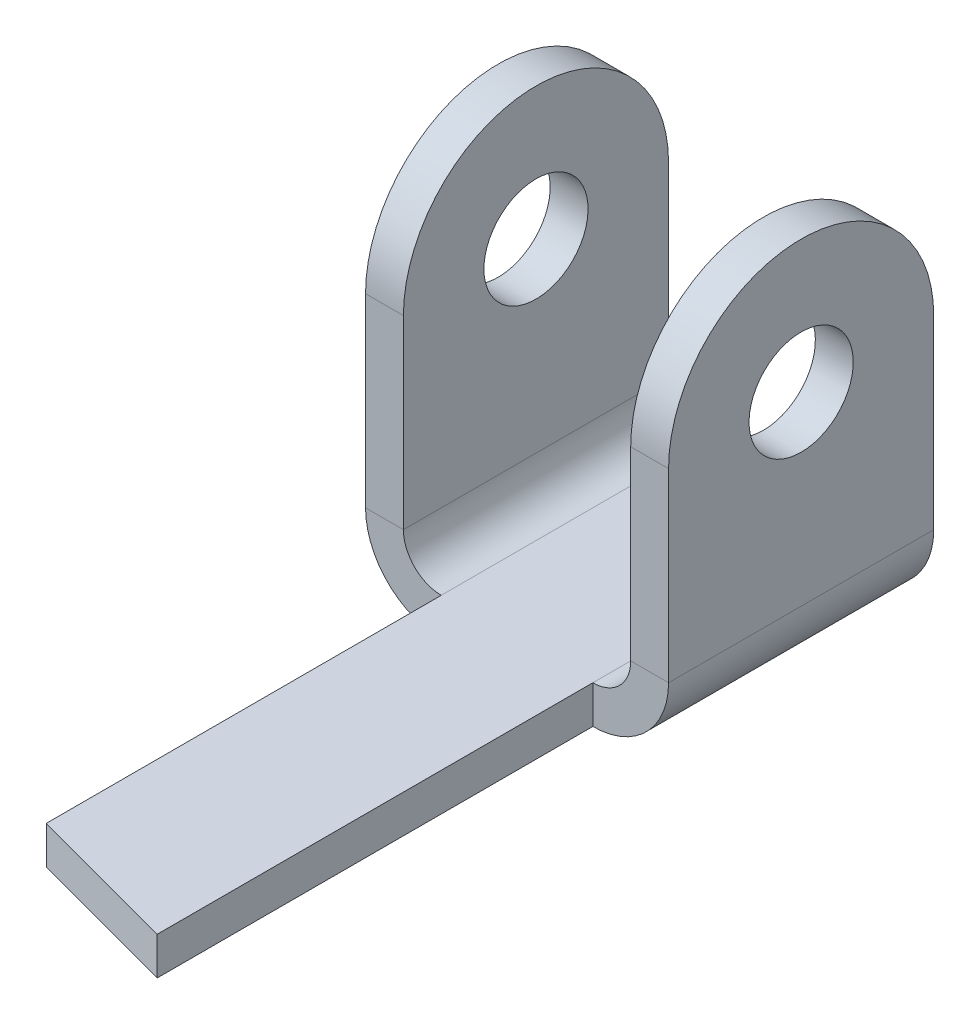
ISO-10303-21;
HEADER;
FILE_DESCRIPTION(('STEP AP214'),'2;1');
FILE_NAME('part.step','',(''),(''),'','','');
FILE_SCHEMA(('AUTOMOTIVE_DESIGN { 1 0 10303 214 1 1 1 1 }'));
ENDSEC;
DATA;
#1=APPLICATION_CONTEXT('core data for automotive mechanical design processes');
#2=APPLICATION_PROTOCOL_DEFINITION('international standard','automotive_design',2000,#1);
#3=PRODUCT_CONTEXT('',#1,'mechanical');
#4=PRODUCT('Part','Part','',(#3));
#5=PRODUCT_RELATED_PRODUCT_CATEGORY('part','',(#4));
#6=PRODUCT_DEFINITION_FORMATION('','',#4);
#7=PRODUCT_DEFINITION_CONTEXT('part definition',#1,'design');
#8=PRODUCT_DEFINITION('design','',#6,#7);
#9=PRODUCT_DEFINITION_SHAPE('','',#8);
#10=(LENGTH_UNIT() NAMED_UNIT(*) SI_UNIT(.MILLI.,.METRE.));
#11=(NAMED_UNIT(*) PLANE_ANGLE_UNIT() SI_UNIT($,.RADIAN.));
#12=(NAMED_UNIT(*) SI_UNIT($,.STERADIAN.) SOLID_ANGLE_UNIT());
#13=UNCERTAINTY_MEASURE_WITH_UNIT(LENGTH_MEASURE(1.E-05),#10,'distance_accuracy_value','');
#14=(GEOMETRIC_REPRESENTATION_CONTEXT(3) GLOBAL_UNCERTAINTY_ASSIGNED_CONTEXT((#13)) GLOBAL_UNIT_ASSIGNED_CONTEXT((#10,
#11,#12)) REPRESENTATION_CONTEXT('',''));
#15=CARTESIAN_POINT('',(0.,0.,0.));
#16=DIRECTION('',(0.,0.,1.));
#17=DIRECTION('',(1.,0.,0.));
#18=AXIS2_PLACEMENT_3D('',#15,#16,#17);
#19=CARTESIAN_POINT('',(-4.,-2.,18.5));
#20=DIRECTION('',(-1.,0.,0.));
#21=DIRECTION('',(0.,0.,1.));
#22=AXIS2_PLACEMENT_3D('',#19,#20,#21);
#23=PLANE('',#22);
#24=DIRECTION('',(0.,0.,1.));
#25=VECTOR('',#24,1.);
#26=CARTESIAN_POINT('',(-4.,-2.,18.5));
#27=LINE('',#26,#25);
#28=CARTESIAN_POINT('',(-4.,-2.,-4.5));
#29=VERTEX_POINT('',#28);
#30=CARTESIAN_POINT('',(-4.,-2.,16.3564064605511));
#31=VERTEX_POINT('',#30);
#32=EDGE_CURVE('E194',#29,#31,#27,.T.);
#33=ORIENTED_EDGE('',*,*,#32,.T.);
#34=DIRECTION('',(0.,-1.,0.));
#35=VECTOR('',#34,1.);
#36=CARTESIAN_POINT('',(-4.,-2.,16.3564064605511));
#37=LINE('',#36,#35);
#38=CARTESIAN_POINT('',(-4.,0.,16.3564064605511));
#39=VERTEX_POINT('',#38);
#40=EDGE_CURVE('E180',#31,#39,#37,.F.);
#41=ORIENTED_EDGE('',*,*,#40,.T.);
#42=DIRECTION('',(0.,0.,1.));
#43=VECTOR('',#42,1.);
#44=CARTESIAN_POINT('',(-4.,0.,18.5));
#45=LINE('',#44,#43);
#46=CARTESIAN_POINT('',(-4.,0.,-4.5));
#47=VERTEX_POINT('',#46);
#48=EDGE_CURVE('E191',#47,#39,#45,.T.);
#49=ORIENTED_EDGE('',*,*,#48,.F.);
#50=DIRECTION('',(0.,-1.,0.));
#51=VECTOR('',#50,1.);
#52=CARTESIAN_POINT('',(-4.,0.,-4.5));
#53=LINE('',#52,#51);
#54=EDGE_CURVE('E240',#47,#29,#53,.T.);
#55=ORIENTED_EDGE('',*,*,#54,.T.);
#56=EDGE_LOOP('',(#33,#41,#49,#55));
#57=FACE_BOUND('',#56,.T.);
#58=ADVANCED_FACE('F75',(#57),#23,.T.);
#59=CARTESIAN_POINT('',(0.,-2.,0.));
#60=DIRECTION('',(0.,-1.,0.));
#61=DIRECTION('',(0.,0.,-1.));
#62=AXIS2_PLACEMENT_3D('',#59,#60,#61);
#63=PLANE('',#62);
#64=DIRECTION('',(0.,0.,-1.));
#65=VECTOR('',#64,1.);
#66=CARTESIAN_POINT('',(4.,-2.,18.5));
#67=LINE('',#66,#65);
#68=CARTESIAN_POINT('',(4.,-2.,18.5));
#69=VERTEX_POINT('',#68);
#70=CARTESIAN_POINT('',(4.,-2.,-4.5));
#71=VERTEX_POINT('',#70);
#72=EDGE_CURVE('E202',#69,#71,#67,.T.);
#73=ORIENTED_EDGE('',*,*,#72,.F.);
#74=DIRECTION('',(-0.96592582628907,0.,-0.258819045102514));
#75=VECTOR('',#74,1.);
#76=CARTESIAN_POINT('',(-4.35705080756878,-2.,16.2607349850061));
#77=LINE('',#76,#75);
#78=EDGE_CURVE('E185',#69,#31,#77,.T.);
#79=ORIENTED_EDGE('',*,*,#78,.T.);
#80=ORIENTED_EDGE('',*,*,#32,.F.);
#81=CARTESIAN_POINT('',(-4.,-2.,-18.5));
#82=VERTEX_POINT('',#81);
#83=EDGE_CURVE('E219',#82,#29,#27,.T.);
#84=ORIENTED_EDGE('',*,*,#83,.F.);
#85=DIRECTION('',(-1.,0.,0.));
#86=VECTOR('',#85,1.);
#87=CARTESIAN_POINT('',(-4.,-2.,-18.5));
#88=LINE('',#87,#86);
#89=CARTESIAN_POINT('',(4.,-2.,-18.5));
#90=VERTEX_POINT('',#89);
#91=EDGE_CURVE('E228',#90,#82,#88,.T.);
#92=ORIENTED_EDGE('',*,*,#91,.F.);
#93=DIRECTION('',(0.,0.,-1.));
#94=VECTOR('',#93,1.);
#95=CARTESIAN_POINT('',(4.,-2.,-18.5));
#96=LINE('',#95,#94);
#97=EDGE_CURVE('E365',#90,#71,#96,.F.);
#98=ORIENTED_EDGE('',*,*,#97,.T.);
#99=EDGE_LOOP('',(#73,#79,#80,#84,#92,#98));
#100=FACE_BOUND('',#99,.T.);
#101=ADVANCED_FACE('F328',(#100),#63,.T.);
#102=CARTESIAN_POINT('',(0.,0.,0.));
#103=DIRECTION('',(0.,-1.,0.));
#104=DIRECTION('',(0.,0.,-1.));
#105=AXIS2_PLACEMENT_3D('',#102,#103,#104);
#106=PLANE('',#105);
#107=DIRECTION('',(-0.96592582628907,0.,-0.258819045102514));
#108=VECTOR('',#107,1.);
#109=CARTESIAN_POINT('',(-4.35705080756878,0.,16.2607349850061));
#110=LINE('',#109,#108);
#111=CARTESIAN_POINT('',(4.,0.,18.5));
#112=VERTEX_POINT('',#111);
#113=EDGE_CURVE('E177',#112,#39,#110,.T.);
#114=ORIENTED_EDGE('',*,*,#113,.F.);
#115=DIRECTION('',(0.,0.,-1.));
#116=VECTOR('',#115,1.);
#117=CARTESIAN_POINT('',(4.,0.,18.5));
#118=LINE('',#117,#116);
#119=CARTESIAN_POINT('',(4.,0.,-4.5));
#120=VERTEX_POINT('',#119);
#121=EDGE_CURVE('E204',#112,#120,#118,.T.);
#122=ORIENTED_EDGE('',*,*,#121,.T.);
#123=DIRECTION('',(0.,0.,-1.));
#124=VECTOR('',#123,1.);
#125=CARTESIAN_POINT('',(4.,0.,-18.5));
#126=LINE('',#125,#124);
#127=CARTESIAN_POINT('',(4.,0.,-18.5));
#128=VERTEX_POINT('',#127);
#129=EDGE_CURVE('E345',#128,#120,#126,.F.);
#130=ORIENTED_EDGE('',*,*,#129,.F.);
#131=DIRECTION('',(-1.,0.,0.));
#132=VECTOR('',#131,1.);
#133=CARTESIAN_POINT('',(-4.,0.,-18.5));
#134=LINE('',#133,#132);
#135=CARTESIAN_POINT('',(-4.,0.,-18.5));
#136=VERTEX_POINT('',#135);
#137=EDGE_CURVE('E200',#128,#136,#134,.T.);
#138=ORIENTED_EDGE('',*,*,#137,.T.);
#139=EDGE_CURVE('E199',#136,#47,#45,.T.);
#140=ORIENTED_EDGE('',*,*,#139,.T.);
#141=ORIENTED_EDGE('',*,*,#48,.T.);
#142=EDGE_LOOP('',(#114,#122,#130,#138,#140,#141));
#143=FACE_BOUND('',#142,.T.);
#144=ADVANCED_FACE('F197',(#143),#106,.F.);
#145=CARTESIAN_POINT('',(4.,-2.,18.5));
#146=DIRECTION('',(1.,0.,0.));
#147=DIRECTION('',(0.,0.,-1.));
#148=AXIS2_PLACEMENT_3D('',#145,#146,#147);
#149=PLANE('',#148);
#150=DIRECTION('',(0.,-1.,0.));
#151=VECTOR('',#150,1.);
#152=CARTESIAN_POINT('',(4.,0.,-4.5));
#153=LINE('',#152,#151);
#154=EDGE_CURVE('E92',#120,#71,#153,.T.);
#155=ORIENTED_EDGE('',*,*,#154,.F.);
#156=ORIENTED_EDGE('',*,*,#121,.F.);
#157=DIRECTION('',(0.,1.,0.));
#158=VECTOR('',#157,1.);
#159=CARTESIAN_POINT('',(4.,-2.,18.5));
#160=LINE('',#159,#158);
#161=EDGE_CURVE('E13',#69,#112,#160,.T.);
#162=ORIENTED_EDGE('',*,*,#161,.F.);
#163=ORIENTED_EDGE('',*,*,#72,.T.);
#164=EDGE_LOOP('',(#155,#156,#162,#163));
#165=FACE_BOUND('',#164,.T.);
#166=ADVANCED_FACE('F77',(#165),#149,.T.);
#167=CARTESIAN_POINT('',(-4.,-2.,-18.5));
#168=DIRECTION('',(0.,0.,-1.));
#169=DIRECTION('',(-1.,0.,0.));
#170=AXIS2_PLACEMENT_3D('',#167,#168,#169);
#171=PLANE('',#170);
#172=ORIENTED_EDGE('',*,*,#137,.F.);
#173=DIRECTION('',(0.,1.,0.));
#174=VECTOR('',#173,1.);
#175=CARTESIAN_POINT('',(4.,-2.,-18.5));
#176=LINE('',#175,#174);
#177=EDGE_CURVE('E208',#90,#128,#176,.T.);
#178=ORIENTED_EDGE('',*,*,#177,.F.);
#179=ORIENTED_EDGE('',*,*,#91,.T.);
#180=DIRECTION('',(0.,1.,0.));
#181=VECTOR('',#180,1.);
#182=CARTESIAN_POINT('',(-4.,-2.,-18.5));
#183=LINE('',#182,#181);
#184=EDGE_CURVE('E84',#82,#136,#183,.T.);
#185=ORIENTED_EDGE('',*,*,#184,.T.);
#186=EDGE_LOOP('',(#172,#178,#179,#185));
#187=FACE_BOUND('',#186,.T.);
#188=ADVANCED_FACE('F336',(#187),#171,.T.);
#189=CARTESIAN_POINT('',(-4.,2.,-18.5));
#190=DIRECTION('',(0.,0.,-1.));
#191=DIRECTION('',(-1.,0.,0.));
#192=AXIS2_PLACEMENT_3D('',#189,#190,#191);
#193=PLANE('',#192);
#194=DIRECTION('',(1.,0.,0.));
#195=VECTOR('',#194,1.);
#196=CARTESIAN_POINT('',(-8.,1.99999999999999,-18.5));
#197=LINE('',#196,#195);
#198=CARTESIAN_POINT('',(-6.,1.99999999999999,-18.5));
#199=VERTEX_POINT('',#198);
#200=CARTESIAN_POINT('',(-8.,1.99999999999999,-18.5));
#201=VERTEX_POINT('',#200);
#202=EDGE_CURVE('E291',#199,#201,#197,.F.);
#203=ORIENTED_EDGE('',*,*,#202,.F.);
#204=CARTESIAN_POINT('',(-4.,2.,-18.5));
#205=DIRECTION('',(0.,0.,1.));
#206=DIRECTION('',(1.,0.,0.));
#207=AXIS2_PLACEMENT_3D('',#204,#205,#206);
#208=CIRCLE('',#207,2.);
#209=EDGE_CURVE('E250',#136,#199,#208,.F.);
#210=ORIENTED_EDGE('',*,*,#209,.F.);
#211=ORIENTED_EDGE('',*,*,#184,.F.);
#212=CARTESIAN_POINT('',(-4.,2.,-18.5));
#213=DIRECTION('',(0.,0.,1.));
#214=DIRECTION('',(1.,0.,0.));
#215=AXIS2_PLACEMENT_3D('',#212,#213,#214);
#216=CIRCLE('',#215,4.);
#217=EDGE_CURVE('E253',#82,#201,#216,.F.);
#218=ORIENTED_EDGE('',*,*,#217,.T.);
#219=EDGE_LOOP('',(#203,#210,#211,#218));
#220=FACE_BOUND('',#219,.T.);
#221=ADVANCED_FACE('F295',(#220),#193,.T.);
#222=CARTESIAN_POINT('',(-4.,2.,-4.5));
#223=DIRECTION('',(0.,0.,-1.));
#224=DIRECTION('',(-1.,0.,0.));
#225=AXIS2_PLACEMENT_3D('',#222,#223,#224);
#226=PLANE('',#225);
#227=CARTESIAN_POINT('',(-4.,2.,-4.5));
#228=DIRECTION('',(0.,0.,1.));
#229=DIRECTION('',(1.,0.,0.));
#230=AXIS2_PLACEMENT_3D('',#227,#228,#229);
#231=CIRCLE('',#230,2.);
#232=CARTESIAN_POINT('',(-6.,1.99999999999999,-4.5));
#233=VERTEX_POINT('',#232);
#234=EDGE_CURVE('E255',#233,#47,#231,.T.);
#235=ORIENTED_EDGE('',*,*,#234,.F.);
#236=DIRECTION('',(1.,0.,0.));
#237=VECTOR('',#236,1.);
#238=CARTESIAN_POINT('',(-6.,1.99999999999999,-4.5));
#239=LINE('',#238,#237);
#240=CARTESIAN_POINT('',(-8.,1.99999999999999,-4.5));
#241=VERTEX_POINT('',#240);
#242=EDGE_CURVE('E287',#233,#241,#239,.F.);
#243=ORIENTED_EDGE('',*,*,#242,.T.);
#244=CARTESIAN_POINT('',(-4.,2.,-4.5));
#245=DIRECTION('',(0.,0.,1.));
#246=DIRECTION('',(1.,0.,0.));
#247=AXIS2_PLACEMENT_3D('',#244,#245,#246);
#248=CIRCLE('',#247,4.);
#249=EDGE_CURVE('E100',#241,#29,#248,.T.);
#250=ORIENTED_EDGE('',*,*,#249,.T.);
#251=ORIENTED_EDGE('',*,*,#54,.F.);
#252=EDGE_LOOP('',(#235,#243,#250,#251));
#253=FACE_BOUND('',#252,.T.);
#254=ADVANCED_FACE('F313',(#253),#226,.F.);
#255=CARTESIAN_POINT('',(-4.,2.,-4.5));
#256=DIRECTION('',(0.,0.,1.));
#257=DIRECTION('',(-1.,0.,0.));
#258=AXIS2_PLACEMENT_3D('',#255,#256,#257);
#259=CYLINDRICAL_SURFACE('',#258,4.);
#260=ORIENTED_EDGE('',*,*,#83,.T.);
#261=ORIENTED_EDGE('',*,*,#249,.F.);
#262=DIRECTION('',(0.,0.,1.));
#263=VECTOR('',#262,1.);
#264=CARTESIAN_POINT('',(-8.,1.99999999999999,-18.5));
#265=LINE('',#264,#263);
#266=EDGE_CURVE('E285',#241,#201,#265,.F.);
#267=ORIENTED_EDGE('',*,*,#266,.T.);
#268=ORIENTED_EDGE('',*,*,#217,.F.);
#269=EDGE_LOOP('',(#260,#261,#267,#268));
#270=FACE_BOUND('',#269,.T.);
#271=ADVANCED_FACE('F323',(#270),#259,.T.);
#272=CARTESIAN_POINT('',(-4.,2.,-4.5));
#273=DIRECTION('',(0.,0.,1.));
#274=DIRECTION('',(-1.,0.,0.));
#275=AXIS2_PLACEMENT_3D('',#272,#273,#274);
#276=CYLINDRICAL_SURFACE('',#275,2.);
#277=ORIENTED_EDGE('',*,*,#139,.F.);
#278=ORIENTED_EDGE('',*,*,#209,.T.);
#279=DIRECTION('',(0.,0.,1.));
#280=VECTOR('',#279,1.);
#281=CARTESIAN_POINT('',(-6.,1.99999999999999,-18.5));
#282=LINE('',#281,#280);
#283=EDGE_CURVE('E289',#199,#233,#282,.T.);
#284=ORIENTED_EDGE('',*,*,#283,.T.);
#285=ORIENTED_EDGE('',*,*,#234,.T.);
#286=EDGE_LOOP('',(#277,#278,#284,#285));
#287=FACE_BOUND('',#286,.T.);
#288=ADVANCED_FACE('F311',(#287),#276,.F.);
#289=CARTESIAN_POINT('',(-8.00000000000004,11.79,-4.5));
#290=DIRECTION('',(0.,0.,-1.));
#291=DIRECTION('',(0.,1.,0.));
#292=AXIS2_PLACEMENT_3D('',#289,#290,#291);
#293=PLANE('',#292);
#294=ORIENTED_EDGE('',*,*,#242,.F.);
#295=DIRECTION('',(0.,-1.,0.));
#296=VECTOR('',#295,1.);
#297=CARTESIAN_POINT('',(-6.00000000000003,11.79,-4.5));
#298=LINE('',#297,#296);
#299=CARTESIAN_POINT('',(-6.00000000000003,11.79,-4.5));
#300=VERTEX_POINT('',#299);
#301=EDGE_CURVE('E283',#233,#300,#298,.F.);
#302=ORIENTED_EDGE('',*,*,#301,.T.);
#303=DIRECTION('',(1.,0.,0.));
#304=VECTOR('',#303,1.);
#305=CARTESIAN_POINT('',(-8.00000000000004,11.79,-4.5));
#306=LINE('',#305,#304);
#307=CARTESIAN_POINT('',(-8.00000000000004,11.79,-4.5));
#308=VERTEX_POINT('',#307);
#309=EDGE_CURVE('E257',#308,#300,#306,.T.);
#310=ORIENTED_EDGE('',*,*,#309,.F.);
#311=DIRECTION('',(0.,1.,0.));
#312=VECTOR('',#311,1.);
#313=CARTESIAN_POINT('',(-8.00000000000004,11.79,-4.5));
#314=LINE('',#313,#312);
#315=EDGE_CURVE('E276',#241,#308,#314,.T.);
#316=ORIENTED_EDGE('',*,*,#315,.F.);
#317=EDGE_LOOP('',(#294,#302,#310,#316));
#318=FACE_BOUND('',#317,.T.);
#319=ADVANCED_FACE('F315',(#318),#293,.F.);
#320=CARTESIAN_POINT('',(-7.99999999999999,0.,-18.5));
#321=DIRECTION('',(0.,0.,1.));
#322=DIRECTION('',(1.,0.,0.));
#323=AXIS2_PLACEMENT_3D('',#320,#321,#322);
#324=PLANE('',#323);
#325=ORIENTED_EDGE('',*,*,#202,.T.);
#326=DIRECTION('',(0.,-1.,0.));
#327=VECTOR('',#326,1.);
#328=CARTESIAN_POINT('',(-8.00000000000004,11.79,-18.5));
#329=LINE('',#328,#327);
#330=CARTESIAN_POINT('',(-8.00000000000004,11.79,-18.5));
#331=VERTEX_POINT('',#330);
#332=EDGE_CURVE('E269',#331,#201,#329,.T.);
#333=ORIENTED_EDGE('',*,*,#332,.F.);
#334=DIRECTION('',(1.,0.,0.));
#335=VECTOR('',#334,1.);
#336=CARTESIAN_POINT('',(-8.00000000000004,11.79,-18.5));
#337=LINE('',#336,#335);
#338=CARTESIAN_POINT('',(-6.00000000000003,11.79,-18.5));
#339=VERTEX_POINT('',#338);
#340=EDGE_CURVE('E262',#331,#339,#337,.T.);
#341=ORIENTED_EDGE('',*,*,#340,.T.);
#342=DIRECTION('',(0.,1.,0.));
#343=VECTOR('',#342,1.);
#344=CARTESIAN_POINT('',(-5.99999999999999,0.,-18.5));
#345=LINE('',#344,#343);
#346=EDGE_CURVE('E278',#339,#199,#345,.F.);
#347=ORIENTED_EDGE('',*,*,#346,.T.);
#348=EDGE_LOOP('',(#325,#333,#341,#347));
#349=FACE_BOUND('',#348,.T.);
#350=ADVANCED_FACE('F299',(#349),#324,.F.);
#351=CARTESIAN_POINT('',(-8.00000000000004,11.79,-11.5));
#352=DIRECTION('',(1.,0.,0.));
#353=DIRECTION('',(0.,1.,0.));
#354=AXIS2_PLACEMENT_3D('',#351,#352,#353);
#355=PLANE('',#354);
#356=CARTESIAN_POINT('',(-8.00000000000004,11.79,-11.5));
#357=DIRECTION('',(-1.,0.,0.));
#358=DIRECTION('',(0.,0.,1.));
#359=AXIS2_PLACEMENT_3D('',#356,#357,#358);
#360=CIRCLE('',#359,2.74999999999999);
#361=CARTESIAN_POINT('',(-8.00000000000004,11.79,-8.75000000000001));
#362=VERTEX_POINT('',#361);
#363=EDGE_CURVE('E195',#362,#362,#360,.T.);
#364=ORIENTED_EDGE('',*,*,#363,.F.);
#365=EDGE_LOOP('',(#364));
#366=FACE_BOUND('',#365,.T.);
#367=ORIENTED_EDGE('',*,*,#266,.F.);
#368=ORIENTED_EDGE('',*,*,#315,.T.);
#369=CARTESIAN_POINT('',(-8.00000000000004,11.79,-11.5));
#370=DIRECTION('',(1.,0.,0.));
#371=DIRECTION('',(0.,1.,0.));
#372=AXIS2_PLACEMENT_3D('',#369,#370,#371);
#373=CIRCLE('',#372,7.);
#374=EDGE_CURVE('E274',#308,#331,#373,.F.);
#375=ORIENTED_EDGE('',*,*,#374,.T.);
#376=ORIENTED_EDGE('',*,*,#332,.T.);
#377=EDGE_LOOP('',(#367,#368,#375,#376));
#378=FACE_BOUND('',#377,.T.);
#379=ADVANCED_FACE('F303',(#366,#378),#355,.F.);
#380=CARTESIAN_POINT('',(-6.00000000000003,11.79,-11.5));
#381=DIRECTION('',(1.,0.,0.));
#382=DIRECTION('',(0.,1.,0.));
#383=AXIS2_PLACEMENT_3D('',#380,#381,#382);
#384=PLANE('',#383);
#385=CARTESIAN_POINT('',(-6.00000000000003,11.79,-11.5));
#386=DIRECTION('',(1.,0.,0.));
#387=DIRECTION('',(0.,1.,0.));
#388=AXIS2_PLACEMENT_3D('',#385,#386,#387);
#389=CIRCLE('',#388,2.74999999999999);
#390=CARTESIAN_POINT('',(-6.00000000000004,14.54,-11.5));
#391=VERTEX_POINT('',#390);
#392=EDGE_CURVE('E378',#391,#391,#389,.T.);
#393=ORIENTED_EDGE('',*,*,#392,.F.);
#394=EDGE_LOOP('',(#393));
#395=FACE_BOUND('',#394,.T.);
#396=ORIENTED_EDGE('',*,*,#301,.F.);
#397=ORIENTED_EDGE('',*,*,#283,.F.);
#398=ORIENTED_EDGE('',*,*,#346,.F.);
#399=CARTESIAN_POINT('',(-6.00000000000003,11.79,-11.5));
#400=DIRECTION('',(1.,0.,0.));
#401=DIRECTION('',(0.,1.,0.));
#402=AXIS2_PLACEMENT_3D('',#399,#400,#401);
#403=CIRCLE('',#402,7.);
#404=EDGE_CURVE('E281',#300,#339,#403,.F.);
#405=ORIENTED_EDGE('',*,*,#404,.F.);
#406=EDGE_LOOP('',(#396,#397,#398,#405));
#407=FACE_BOUND('',#406,.T.);
#408=ADVANCED_FACE('F310',(#395,#407),#384,.T.);
#409=CARTESIAN_POINT('',(-8.00000000000004,11.79,-11.5));
#410=DIRECTION('',(1.,0.,0.));
#411=DIRECTION('',(0.,1.,0.));
#412=AXIS2_PLACEMENT_3D('',#409,#410,#411);
#413=CYLINDRICAL_SURFACE('',#412,7.);
#414=ORIENTED_EDGE('',*,*,#404,.T.);
#415=ORIENTED_EDGE('',*,*,#340,.F.);
#416=ORIENTED_EDGE('',*,*,#374,.F.);
#417=ORIENTED_EDGE('',*,*,#309,.T.);
#418=EDGE_LOOP('',(#414,#415,#416,#417));
#419=FACE_BOUND('',#418,.T.);
#420=ADVANCED_FACE('F306',(#419),#413,.T.);
#421=CARTESIAN_POINT('',(4.,2.,-4.5));
#422=DIRECTION('',(0.,0.,1.));
#423=DIRECTION('',(1.,0.,0.));
#424=AXIS2_PLACEMENT_3D('',#421,#422,#423);
#425=PLANE('',#424);
#426=DIRECTION('',(1.,0.,0.));
#427=VECTOR('',#426,1.);
#428=CARTESIAN_POINT('',(8.,1.99999999999999,-4.5));
#429=LINE('',#428,#427);
#430=CARTESIAN_POINT('',(6.,1.99999999999999,-4.5));
#431=VERTEX_POINT('',#430);
#432=CARTESIAN_POINT('',(8.,1.99999999999999,-4.5));
#433=VERTEX_POINT('',#432);
#434=EDGE_CURVE('E373',#431,#433,#429,.T.);
#435=ORIENTED_EDGE('',*,*,#434,.F.);
#436=CARTESIAN_POINT('',(4.,2.,-4.5));
#437=DIRECTION('',(0.,0.,-1.));
#438=DIRECTION('',(-1.,0.,0.));
#439=AXIS2_PLACEMENT_3D('',#436,#437,#438);
#440=CIRCLE('',#439,2.);
#441=EDGE_CURVE('E349',#120,#431,#440,.F.);
#442=ORIENTED_EDGE('',*,*,#441,.F.);
#443=ORIENTED_EDGE('',*,*,#154,.T.);
#444=CARTESIAN_POINT('',(4.,2.,-4.5));
#445=DIRECTION('',(0.,0.,-1.));
#446=DIRECTION('',(-1.,0.,0.));
#447=AXIS2_PLACEMENT_3D('',#444,#445,#446);
#448=CIRCLE('',#447,4.);
#449=EDGE_CURVE('E362',#71,#433,#448,.F.);
#450=ORIENTED_EDGE('',*,*,#449,.T.);
#451=EDGE_LOOP('',(#435,#442,#443,#450));
#452=FACE_BOUND('',#451,.T.);
#453=ADVANCED_FACE('F416',(#452),#425,.T.);
#454=CARTESIAN_POINT('',(4.,2.,-18.5));
#455=DIRECTION('',(0.,0.,1.));
#456=DIRECTION('',(1.,0.,0.));
#457=AXIS2_PLACEMENT_3D('',#454,#455,#456);
#458=PLANE('',#457);
#459=CARTESIAN_POINT('',(4.,2.,-18.5));
#460=DIRECTION('',(0.,0.,-1.));
#461=DIRECTION('',(-1.,0.,0.));
#462=AXIS2_PLACEMENT_3D('',#459,#460,#461);
#463=CIRCLE('',#462,2.);
#464=CARTESIAN_POINT('',(6.,1.99999999999999,-18.5));
#465=VERTEX_POINT('',#464);
#466=EDGE_CURVE('E350',#465,#128,#463,.T.);
#467=ORIENTED_EDGE('',*,*,#466,.F.);
#468=DIRECTION('',(1.,0.,0.));
#469=VECTOR('',#468,1.);
#470=CARTESIAN_POINT('',(6.,1.99999999999999,-18.5));
#471=LINE('',#470,#469);
#472=CARTESIAN_POINT('',(8.,1.99999999999999,-18.5));
#473=VERTEX_POINT('',#472);
#474=EDGE_CURVE('E380',#465,#473,#471,.T.);
#475=ORIENTED_EDGE('',*,*,#474,.T.);
#476=CARTESIAN_POINT('',(4.,2.,-18.5));
#477=DIRECTION('',(0.,0.,-1.));
#478=DIRECTION('',(-1.,0.,0.));
#479=AXIS2_PLACEMENT_3D('',#476,#477,#478);
#480=CIRCLE('',#479,4.);
#481=EDGE_CURVE('E352',#473,#90,#480,.T.);
#482=ORIENTED_EDGE('',*,*,#481,.T.);
#483=ORIENTED_EDGE('',*,*,#177,.T.);
#484=EDGE_LOOP('',(#467,#475,#482,#483));
#485=FACE_BOUND('',#484,.T.);
#486=ADVANCED_FACE('F435',(#485),#458,.F.);
#487=CARTESIAN_POINT('',(4.,2.,-18.5));
#488=DIRECTION('',(0.,0.,-1.));
#489=DIRECTION('',(1.,0.,0.));
#490=AXIS2_PLACEMENT_3D('',#487,#488,#489);
#491=CYLINDRICAL_SURFACE('',#490,4.);
#492=ORIENTED_EDGE('',*,*,#97,.F.);
#493=ORIENTED_EDGE('',*,*,#481,.F.);
#494=DIRECTION('',(0.,0.,-1.));
#495=VECTOR('',#494,1.);
#496=CARTESIAN_POINT('',(8.,1.99999999999999,-4.5));
#497=LINE('',#496,#495);
#498=EDGE_CURVE('E382',#473,#433,#497,.F.);
#499=ORIENTED_EDGE('',*,*,#498,.T.);
#500=ORIENTED_EDGE('',*,*,#449,.F.);
#501=EDGE_LOOP('',(#492,#493,#499,#500));
#502=FACE_BOUND('',#501,.T.);
#503=ADVANCED_FACE('F413',(#502),#491,.T.);
#504=CARTESIAN_POINT('',(4.,2.,-18.5));
#505=DIRECTION('',(0.,0.,-1.));
#506=DIRECTION('',(1.,0.,0.));
#507=AXIS2_PLACEMENT_3D('',#504,#505,#506);
#508=CYLINDRICAL_SURFACE('',#507,2.);
#509=ORIENTED_EDGE('',*,*,#129,.T.);
#510=ORIENTED_EDGE('',*,*,#441,.T.);
#511=DIRECTION('',(0.,0.,-1.));
#512=VECTOR('',#511,1.);
#513=CARTESIAN_POINT('',(6.,1.99999999999999,-4.5));
#514=LINE('',#513,#512);
#515=EDGE_CURVE('E377',#431,#465,#514,.T.);
#516=ORIENTED_EDGE('',*,*,#515,.T.);
#517=ORIENTED_EDGE('',*,*,#466,.T.);
#518=EDGE_LOOP('',(#509,#510,#516,#517));
#519=FACE_BOUND('',#518,.T.);
#520=ADVANCED_FACE('F433',(#519),#508,.F.);
#521=CARTESIAN_POINT('',(7.99999999999999,0.,-18.5));
#522=DIRECTION('',(0.,0.,-1.));
#523=DIRECTION('',(-1.,0.,0.));
#524=AXIS2_PLACEMENT_3D('',#521,#522,#523);
#525=PLANE('',#524);
#526=DIRECTION('',(0.,1.,0.));
#527=VECTOR('',#526,1.);
#528=CARTESIAN_POINT('',(7.99999999999999,0.,-18.5));
#529=LINE('',#528,#527);
#530=CARTESIAN_POINT('',(8.00000000000004,11.79,-18.5));
#531=VERTEX_POINT('',#530);
#532=EDGE_CURVE('E392',#531,#473,#529,.F.);
#533=ORIENTED_EDGE('',*,*,#532,.T.);
#534=ORIENTED_EDGE('',*,*,#474,.F.);
#535=DIRECTION('',(0.,-1.,0.));
#536=VECTOR('',#535,1.);
#537=CARTESIAN_POINT('',(6.00000000000003,11.79,-18.5));
#538=LINE('',#537,#536);
#539=CARTESIAN_POINT('',(6.00000000000003,11.79,-18.5));
#540=VERTEX_POINT('',#539);
#541=EDGE_CURVE('E384',#540,#465,#538,.T.);
#542=ORIENTED_EDGE('',*,*,#541,.F.);
#543=DIRECTION('',(-1.,0.,0.));
#544=VECTOR('',#543,1.);
#545=CARTESIAN_POINT('',(8.00000000000004,11.79,-18.5));
#546=LINE('',#545,#544);
#547=EDGE_CURVE('E354',#531,#540,#546,.T.);
#548=ORIENTED_EDGE('',*,*,#547,.F.);
#549=EDGE_LOOP('',(#533,#534,#542,#548));
#550=FACE_BOUND('',#549,.T.);
#551=ADVANCED_FACE('F437',(#550),#525,.T.);
#552=CARTESIAN_POINT('',(8.00000000000004,11.79,-4.5));
#553=DIRECTION('',(0.,0.,1.));
#554=DIRECTION('',(0.,-1.,0.));
#555=AXIS2_PLACEMENT_3D('',#552,#553,#554);
#556=PLANE('',#555);
#557=DIRECTION('',(0.,1.,0.));
#558=VECTOR('',#557,1.);
#559=CARTESIAN_POINT('',(6.00000000000003,11.79,-4.5));
#560=LINE('',#559,#558);
#561=CARTESIAN_POINT('',(6.00000000000003,11.79,-4.5));
#562=VERTEX_POINT('',#561);
#563=EDGE_CURVE('E390',#431,#562,#560,.T.);
#564=ORIENTED_EDGE('',*,*,#563,.F.);
#565=ORIENTED_EDGE('',*,*,#434,.T.);
#566=DIRECTION('',(0.,-1.,0.));
#567=VECTOR('',#566,1.);
#568=CARTESIAN_POINT('',(8.00000000000004,11.79,-4.5));
#569=LINE('',#568,#567);
#570=CARTESIAN_POINT('',(8.00000000000004,11.79,-4.5));
#571=VERTEX_POINT('',#570);
#572=EDGE_CURVE('E398',#433,#571,#569,.F.);
#573=ORIENTED_EDGE('',*,*,#572,.T.);
#574=DIRECTION('',(-1.,0.,0.));
#575=VECTOR('',#574,1.);
#576=CARTESIAN_POINT('',(8.00000000000004,11.79,-4.5));
#577=LINE('',#576,#575);
#578=EDGE_CURVE('E400',#571,#562,#577,.T.);
#579=ORIENTED_EDGE('',*,*,#578,.T.);
#580=EDGE_LOOP('',(#564,#565,#573,#579));
#581=FACE_BOUND('',#580,.T.);
#582=ADVANCED_FACE('F420',(#581),#556,.T.);
#583=CARTESIAN_POINT('',(8.00000000000004,11.79,-11.5));
#584=DIRECTION('',(-1.,0.,0.));
#585=DIRECTION('',(0.,1.,0.));
#586=AXIS2_PLACEMENT_3D('',#583,#584,#585);
#587=PLANE('',#586);
#588=CARTESIAN_POINT('',(8.00000000000004,11.79,-11.5));
#589=DIRECTION('',(-1.,0.,0.));
#590=DIRECTION('',(0.,-1.,0.));
#591=AXIS2_PLACEMENT_3D('',#588,#589,#590);
#592=CIRCLE('',#591,2.74999999999999);
#593=CARTESIAN_POINT('',(8.00000000000003,9.04,-11.5));
#594=VERTEX_POINT('',#593);
#595=EDGE_CURVE('E406',#594,#594,#592,.T.);
#596=ORIENTED_EDGE('',*,*,#595,.T.);
#597=EDGE_LOOP('',(#596));
#598=FACE_BOUND('',#597,.T.);
#599=ORIENTED_EDGE('',*,*,#498,.F.);
#600=ORIENTED_EDGE('',*,*,#532,.F.);
#601=CARTESIAN_POINT('',(8.00000000000004,11.79,-11.5));
#602=DIRECTION('',(-1.,0.,0.));
#603=DIRECTION('',(0.,-1.,0.));
#604=AXIS2_PLACEMENT_3D('',#601,#602,#603);
#605=CIRCLE('',#604,7.);
#606=EDGE_CURVE('E395',#571,#531,#605,.T.);
#607=ORIENTED_EDGE('',*,*,#606,.F.);
#608=ORIENTED_EDGE('',*,*,#572,.F.);
#609=EDGE_LOOP('',(#599,#600,#607,#608));
#610=FACE_BOUND('',#609,.T.);
#611=ADVANCED_FACE('F424',(#598,#610),#587,.F.);
#612=CARTESIAN_POINT('',(6.00000000000003,11.79,-11.5));
#613=DIRECTION('',(-1.,0.,0.));
#614=DIRECTION('',(0.,1.,0.));
#615=AXIS2_PLACEMENT_3D('',#612,#613,#614);
#616=PLANE('',#615);
#617=CARTESIAN_POINT('',(6.00000000000003,11.79,-11.5));
#618=DIRECTION('',(-1.,0.,0.));
#619=DIRECTION('',(0.,-1.,0.));
#620=AXIS2_PLACEMENT_3D('',#617,#618,#619);
#621=CIRCLE('',#620,2.74999999999999);
#622=CARTESIAN_POINT('',(6.00000000000002,9.04,-11.5));
#623=VERTEX_POINT('',#622);
#624=EDGE_CURVE('E79',#623,#623,#621,.T.);
#625=ORIENTED_EDGE('',*,*,#624,.F.);
#626=EDGE_LOOP('',(#625));
#627=FACE_BOUND('',#626,.T.);
#628=ORIENTED_EDGE('',*,*,#541,.T.);
#629=ORIENTED_EDGE('',*,*,#515,.F.);
#630=ORIENTED_EDGE('',*,*,#563,.T.);
#631=CARTESIAN_POINT('',(6.00000000000003,11.79,-11.5));
#632=DIRECTION('',(-1.,0.,0.));
#633=DIRECTION('',(0.,-1.,0.));
#634=AXIS2_PLACEMENT_3D('',#631,#632,#633);
#635=CIRCLE('',#634,7.);
#636=EDGE_CURVE('E387',#562,#540,#635,.T.);
#637=ORIENTED_EDGE('',*,*,#636,.T.);
#638=EDGE_LOOP('',(#628,#629,#630,#637));
#639=FACE_BOUND('',#638,.T.);
#640=ADVANCED_FACE('F431',(#627,#639),#616,.T.);
#641=CARTESIAN_POINT('',(8.00000000000004,11.79,-11.5));
#642=DIRECTION('',(-1.,0.,0.));
#643=DIRECTION('',(0.,-1.,0.));
#644=AXIS2_PLACEMENT_3D('',#641,#642,#643);
#645=CYLINDRICAL_SURFACE('',#644,7.);
#646=ORIENTED_EDGE('',*,*,#636,.F.);
#647=ORIENTED_EDGE('',*,*,#578,.F.);
#648=ORIENTED_EDGE('',*,*,#606,.T.);
#649=ORIENTED_EDGE('',*,*,#547,.T.);
#650=EDGE_LOOP('',(#646,#647,#648,#649));
#651=FACE_BOUND('',#650,.T.);
#652=ADVANCED_FACE('F428',(#651),#645,.T.);
#653=CARTESIAN_POINT('',(-8.00000000000003,11.79,-11.5));
#654=DIRECTION('',(-1.,0.,0.));
#655=DIRECTION('',(0.,0.,1.));
#656=AXIS2_PLACEMENT_3D('',#653,#654,#655);
#657=CYLINDRICAL_SURFACE('',#656,2.74999999999999);
#658=ORIENTED_EDGE('',*,*,#624,.T.);
#659=EDGE_LOOP('',(#658));
#660=FACE_BOUND('',#659,.T.);
#661=ORIENTED_EDGE('',*,*,#595,.F.);
#662=EDGE_LOOP('',(#661));
#663=FACE_BOUND('',#662,.T.);
#664=ADVANCED_FACE('F505',(#660,#663),#657,.F.);
#665=ORIENTED_EDGE('',*,*,#392,.T.);
#666=EDGE_LOOP('',(#665));
#667=FACE_BOUND('',#666,.T.);
#668=ORIENTED_EDGE('',*,*,#363,.T.);
#669=EDGE_LOOP('',(#668));
#670=FACE_BOUND('',#669,.T.);
#671=ADVANCED_FACE('F545',(#667,#670),#657,.F.);
#672=CARTESIAN_POINT('',(-4.35705080756878,-2.,16.2607349850061));
#673=DIRECTION('',(-0.258819045102514,0.,0.96592582628907));
#674=DIRECTION('',(-0.96592582628907,0.,-0.258819045102514));
#675=AXIS2_PLACEMENT_3D('',#672,#673,#674);
#676=PLANE('',#675);
#677=ORIENTED_EDGE('',*,*,#40,.F.);
#678=ORIENTED_EDGE('',*,*,#78,.F.);
#679=ORIENTED_EDGE('',*,*,#161,.T.);
#680=ORIENTED_EDGE('',*,*,#113,.T.);
#681=EDGE_LOOP('',(#677,#678,#679,#680));
#682=FACE_BOUND('',#681,.T.);
#683=ADVANCED_FACE('F179',(#682),#676,.T.);
#684=CLOSED_SHELL('',(#58,#101,#144,#166,#188,#221,#254,#271,#288,#319,#350,#379,#408,#420,#453,
#486,#503,#520,#551,#582,#611,#640,#652,#664,#671,#683));
#685=MANIFOLD_SOLID_BREP('B2',#684);
#686=ADVANCED_BREP_SHAPE_REPRESENTATION('',(#18,#685),#14);
#687=SHAPE_DEFINITION_REPRESENTATION(#9,#686);
ENDSEC;
END-ISO-10303-21;
